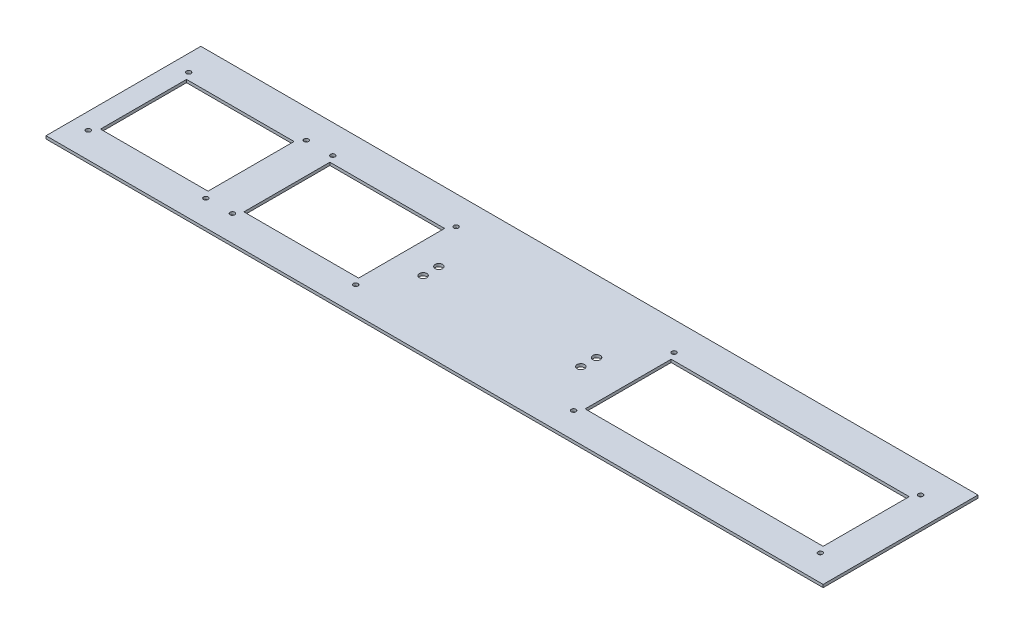
ISO-10303-21;
HEADER;
FILE_DESCRIPTION(('STEP AP214'),'2;1');
FILE_NAME('part.step','',(''),(''),'','','');
FILE_SCHEMA(('AUTOMOTIVE_DESIGN { 1 0 10303 214 1 1 1 1 }'));
ENDSEC;
DATA;
#1=APPLICATION_CONTEXT('core data for automotive mechanical design processes');
#2=APPLICATION_PROTOCOL_DEFINITION('international standard','automotive_design',2000,#1);
#3=PRODUCT_CONTEXT('',#1,'mechanical');
#4=PRODUCT('Part','Part','',(#3));
#5=PRODUCT_RELATED_PRODUCT_CATEGORY('part','',(#4));
#6=PRODUCT_DEFINITION_FORMATION('','',#4);
#7=PRODUCT_DEFINITION_CONTEXT('part definition',#1,'design');
#8=PRODUCT_DEFINITION('design','',#6,#7);
#9=PRODUCT_DEFINITION_SHAPE('','',#8);
#10=(LENGTH_UNIT() NAMED_UNIT(*) SI_UNIT(.MILLI.,.METRE.));
#11=(NAMED_UNIT(*) PLANE_ANGLE_UNIT() SI_UNIT($,.RADIAN.));
#12=(NAMED_UNIT(*) SI_UNIT($,.STERADIAN.) SOLID_ANGLE_UNIT());
#13=UNCERTAINTY_MEASURE_WITH_UNIT(LENGTH_MEASURE(1.E-05),#10,'distance_accuracy_value','');
#14=(GEOMETRIC_REPRESENTATION_CONTEXT(3) GLOBAL_UNCERTAINTY_ASSIGNED_CONTEXT((#13)) GLOBAL_UNIT_ASSIGNED_CONTEXT((#10,
#11,#12)) REPRESENTATION_CONTEXT('',''));
#15=CARTESIAN_POINT('',(0.,0.,0.));
#16=DIRECTION('',(0.,0.,1.));
#17=DIRECTION('',(1.,0.,0.));
#18=AXIS2_PLACEMENT_3D('',#15,#16,#17);
#19=CARTESIAN_POINT('',(0.,0.,108.));
#20=DIRECTION('',(0.,0.,1.));
#21=DIRECTION('',(1.,0.,0.));
#22=AXIS2_PLACEMENT_3D('',#19,#20,#21);
#23=PLANE('',#22);
#24=DIRECTION('',(-1.,0.,0.));
#25=VECTOR('',#24,1.);
#26=CARTESIAN_POINT('',(0.,-1.,108.));
#27=LINE('',#26,#25);
#28=CARTESIAN_POINT('',(271.,-1.,108.));
#29=VERTEX_POINT('',#28);
#30=CARTESIAN_POINT('',(-271.,-1.,108.));
#31=VERTEX_POINT('',#30);
#32=EDGE_CURVE('E332',#29,#31,#27,.T.);
#33=ORIENTED_EDGE('',*,*,#32,.F.);
#34=DIRECTION('',(0.,-1.,0.));
#35=VECTOR('',#34,1.);
#36=CARTESIAN_POINT('',(271.,0.,108.));
#37=LINE('',#36,#35);
#38=CARTESIAN_POINT('',(271.,1.,108.));
#39=VERTEX_POINT('',#38);
#40=EDGE_CURVE('E325',#39,#29,#37,.T.);
#41=ORIENTED_EDGE('',*,*,#40,.F.);
#42=DIRECTION('',(1.,0.,0.));
#43=VECTOR('',#42,1.);
#44=CARTESIAN_POINT('',(0.,1.,108.));
#45=LINE('',#44,#43);
#46=CARTESIAN_POINT('',(-271.,1.,108.));
#47=VERTEX_POINT('',#46);
#48=EDGE_CURVE('E328',#47,#39,#45,.T.);
#49=ORIENTED_EDGE('',*,*,#48,.F.);
#50=DIRECTION('',(0.,1.,0.));
#51=VECTOR('',#50,1.);
#52=CARTESIAN_POINT('',(-271.,0.,108.));
#53=LINE('',#52,#51);
#54=EDGE_CURVE('E330',#31,#47,#53,.T.);
#55=ORIENTED_EDGE('',*,*,#54,.F.);
#56=EDGE_LOOP('',(#33,#41,#49,#55));
#57=FACE_BOUND('',#56,.T.);
#58=ADVANCED_FACE('F16',(#57),#23,.T.);
#59=CARTESIAN_POINT('',(0.,-1.,0.));
#60=DIRECTION('',(0.,-1.,0.));
#61=DIRECTION('',(0.,0.,-1.));
#62=AXIS2_PLACEMENT_3D('',#59,#60,#61);
#63=PLANE('',#62);
#64=CARTESIAN_POINT('',(55.,-1.,61.));
#65=DIRECTION('',(0.,-1.,0.));
#66=DIRECTION('',(0.,0.,-1.));
#67=AXIS2_PLACEMENT_3D('',#64,#65,#66);
#68=CIRCLE('',#67,2.6);
#69=CARTESIAN_POINT('',(55.,-1.,58.4));
#70=VERTEX_POINT('',#69);
#71=EDGE_CURVE('E208',#70,#70,#68,.T.);
#72=ORIENTED_EDGE('',*,*,#71,.F.);
#73=EDGE_LOOP('',(#72));
#74=FACE_BOUND('',#73,.T.);
#75=CARTESIAN_POINT('',(55.,-1.,50.));
#76=DIRECTION('',(0.,-1.,0.));
#77=DIRECTION('',(0.,0.,-1.));
#78=AXIS2_PLACEMENT_3D('',#75,#76,#77);
#79=CIRCLE('',#78,2.6);
#80=CARTESIAN_POINT('',(55.,-1.,47.4));
#81=VERTEX_POINT('',#80);
#82=EDGE_CURVE('E205',#81,#81,#79,.T.);
#83=ORIENTED_EDGE('',*,*,#82,.F.);
#84=EDGE_LOOP('',(#83));
#85=FACE_BOUND('',#84,.T.);
#86=CARTESIAN_POINT('',(-55.,-1.,61.));
#87=DIRECTION('',(0.,-1.,0.));
#88=DIRECTION('',(0.,0.,-1.));
#89=AXIS2_PLACEMENT_3D('',#86,#87,#88);
#90=CIRCLE('',#89,2.6);
#91=CARTESIAN_POINT('',(-55.,-1.,58.4));
#92=VERTEX_POINT('',#91);
#93=EDGE_CURVE('E202',#92,#92,#90,.T.);
#94=ORIENTED_EDGE('',*,*,#93,.F.);
#95=EDGE_LOOP('',(#94));
#96=FACE_BOUND('',#95,.T.);
#97=CARTESIAN_POINT('',(-55.,-1.,50.));
#98=DIRECTION('',(0.,-1.,0.));
#99=DIRECTION('',(0.,0.,-1.));
#100=AXIS2_PLACEMENT_3D('',#97,#98,#99);
#101=CIRCLE('',#100,2.6);
#102=CARTESIAN_POINT('',(-55.,-1.,47.4));
#103=VERTEX_POINT('',#102);
#104=EDGE_CURVE('E198',#103,#103,#101,.T.);
#105=ORIENTED_EDGE('',*,*,#104,.F.);
#106=EDGE_LOOP('',(#105));
#107=FACE_BOUND('',#106,.T.);
#108=CARTESIAN_POINT('',(251.,-1.,90.));
#109=DIRECTION('',(0.,-1.,0.));
#110=DIRECTION('',(0.,0.,-1.));
#111=AXIS2_PLACEMENT_3D('',#108,#109,#110);
#112=CIRCLE('',#111,1.6);
#113=CARTESIAN_POINT('',(251.,-1.,88.4));
#114=VERTEX_POINT('',#113);
#115=EDGE_CURVE('E194',#114,#114,#112,.T.);
#116=ORIENTED_EDGE('',*,*,#115,.F.);
#117=EDGE_LOOP('',(#116));
#118=FACE_BOUND('',#117,.T.);
#119=CARTESIAN_POINT('',(251.,-1.,20.));
#120=DIRECTION('',(0.,-1.,0.));
#121=DIRECTION('',(0.,0.,-1.));
#122=AXIS2_PLACEMENT_3D('',#119,#120,#121);
#123=CIRCLE('',#122,1.6);
#124=CARTESIAN_POINT('',(251.,-1.,18.4));
#125=VERTEX_POINT('',#124);
#126=EDGE_CURVE('E190',#125,#125,#123,.T.);
#127=ORIENTED_EDGE('',*,*,#126,.F.);
#128=EDGE_LOOP('',(#127));
#129=FACE_BOUND('',#128,.T.);
#130=CARTESIAN_POINT('',(79.,-1.,90.));
#131=DIRECTION('',(0.,-1.,0.));
#132=DIRECTION('',(0.,0.,-1.));
#133=AXIS2_PLACEMENT_3D('',#130,#131,#132);
#134=CIRCLE('',#133,1.6);
#135=CARTESIAN_POINT('',(79.,-1.,88.4));
#136=VERTEX_POINT('',#135);
#137=EDGE_CURVE('E186',#136,#136,#134,.T.);
#138=ORIENTED_EDGE('',*,*,#137,.F.);
#139=EDGE_LOOP('',(#138));
#140=FACE_BOUND('',#139,.T.);
#141=CARTESIAN_POINT('',(79.,-1.,20.));
#142=DIRECTION('',(0.,-1.,0.));
#143=DIRECTION('',(0.,0.,-1.));
#144=AXIS2_PLACEMENT_3D('',#141,#142,#143);
#145=CIRCLE('',#144,1.6);
#146=CARTESIAN_POINT('',(79.,-1.,18.4));
#147=VERTEX_POINT('',#146);
#148=EDGE_CURVE('E182',#147,#147,#145,.T.);
#149=ORIENTED_EDGE('',*,*,#148,.F.);
#150=EDGE_LOOP('',(#149));
#151=FACE_BOUND('',#150,.T.);
#152=CARTESIAN_POINT('',(-73.,-1.,90.));
#153=DIRECTION('',(0.,-1.,0.));
#154=DIRECTION('',(0.,0.,-1.));
#155=AXIS2_PLACEMENT_3D('',#152,#153,#154);
#156=CIRCLE('',#155,1.6);
#157=CARTESIAN_POINT('',(-73.,-1.,88.4));
#158=VERTEX_POINT('',#157);
#159=EDGE_CURVE('E178',#158,#158,#156,.T.);
#160=ORIENTED_EDGE('',*,*,#159,.F.);
#161=EDGE_LOOP('',(#160));
#162=FACE_BOUND('',#161,.T.);
#163=CARTESIAN_POINT('',(-73.,-1.,20.));
#164=DIRECTION('',(0.,-1.,0.));
#165=DIRECTION('',(0.,0.,-1.));
#166=AXIS2_PLACEMENT_3D('',#163,#164,#165);
#167=CIRCLE('',#166,1.6);
#168=CARTESIAN_POINT('',(-73.,-1.,18.4));
#169=VERTEX_POINT('',#168);
#170=EDGE_CURVE('E174',#169,#169,#167,.T.);
#171=ORIENTED_EDGE('',*,*,#170,.F.);
#172=EDGE_LOOP('',(#171));
#173=FACE_BOUND('',#172,.T.);
#174=CARTESIAN_POINT('',(-159.,-1.,90.));
#175=DIRECTION('',(0.,-1.,0.));
#176=DIRECTION('',(0.,0.,-1.));
#177=AXIS2_PLACEMENT_3D('',#174,#175,#176);
#178=CIRCLE('',#177,1.6);
#179=CARTESIAN_POINT('',(-159.,-1.,88.4));
#180=VERTEX_POINT('',#179);
#181=EDGE_CURVE('E170',#180,#180,#178,.T.);
#182=ORIENTED_EDGE('',*,*,#181,.F.);
#183=EDGE_LOOP('',(#182));
#184=FACE_BOUND('',#183,.T.);
#185=CARTESIAN_POINT('',(-159.,-1.,20.));
#186=DIRECTION('',(0.,-1.,0.));
#187=DIRECTION('',(0.,0.,-1.));
#188=AXIS2_PLACEMENT_3D('',#185,#186,#187);
#189=CIRCLE('',#188,1.6);
#190=CARTESIAN_POINT('',(-159.,-1.,18.4));
#191=VERTEX_POINT('',#190);
#192=EDGE_CURVE('E166',#191,#191,#189,.T.);
#193=ORIENTED_EDGE('',*,*,#192,.F.);
#194=EDGE_LOOP('',(#193));
#195=FACE_BOUND('',#194,.T.);
#196=CARTESIAN_POINT('',(-177.5,-1.,90.));
#197=DIRECTION('',(0.,-1.,0.));
#198=DIRECTION('',(0.,0.,-1.));
#199=AXIS2_PLACEMENT_3D('',#196,#197,#198);
#200=CIRCLE('',#199,1.6);
#201=CARTESIAN_POINT('',(-177.5,-1.,88.4));
#202=VERTEX_POINT('',#201);
#203=EDGE_CURVE('E162',#202,#202,#200,.T.);
#204=ORIENTED_EDGE('',*,*,#203,.F.);
#205=EDGE_LOOP('',(#204));
#206=FACE_BOUND('',#205,.T.);
#207=CARTESIAN_POINT('',(-177.5,-1.,20.));
#208=DIRECTION('',(0.,-1.,0.));
#209=DIRECTION('',(0.,0.,-1.));
#210=AXIS2_PLACEMENT_3D('',#207,#208,#209);
#211=CIRCLE('',#210,1.6);
#212=CARTESIAN_POINT('',(-177.5,-1.,18.4));
#213=VERTEX_POINT('',#212);
#214=EDGE_CURVE('E158',#213,#213,#211,.T.);
#215=ORIENTED_EDGE('',*,*,#214,.F.);
#216=EDGE_LOOP('',(#215));
#217=FACE_BOUND('',#216,.T.);
#218=CARTESIAN_POINT('',(-259.5,-1.,90.));
#219=DIRECTION('',(0.,-1.,0.));
#220=DIRECTION('',(0.,0.,-1.));
#221=AXIS2_PLACEMENT_3D('',#218,#219,#220);
#222=CIRCLE('',#221,1.6);
#223=CARTESIAN_POINT('',(-259.5,-1.,88.4));
#224=VERTEX_POINT('',#223);
#225=EDGE_CURVE('E154',#224,#224,#222,.T.);
#226=ORIENTED_EDGE('',*,*,#225,.F.);
#227=EDGE_LOOP('',(#226));
#228=FACE_BOUND('',#227,.T.);
#229=CARTESIAN_POINT('',(-259.5,-1.,20.));
#230=DIRECTION('',(0.,-1.,0.));
#231=DIRECTION('',(0.,0.,-1.));
#232=AXIS2_PLACEMENT_3D('',#229,#230,#231);
#233=CIRCLE('',#232,1.6);
#234=CARTESIAN_POINT('',(-259.5,-1.,18.4));
#235=VERTEX_POINT('',#234);
#236=EDGE_CURVE('E153',#235,#235,#233,.T.);
#237=ORIENTED_EDGE('',*,*,#236,.F.);
#238=EDGE_LOOP('',(#237));
#239=FACE_BOUND('',#238,.T.);
#240=DIRECTION('',(-1.,0.,0.));
#241=VECTOR('',#240,1.);
#242=CARTESIAN_POINT('',(0.,-1.,85.));
#243=LINE('',#242,#241);
#244=CARTESIAN_POINT('',(248.,-1.,85.));
#245=VERTEX_POINT('',#244);
#246=CARTESIAN_POINT('',(82.,-1.,85.));
#247=VERTEX_POINT('',#246);
#248=EDGE_CURVE('E257',#245,#247,#243,.T.);
#249=ORIENTED_EDGE('',*,*,#248,.F.);
#250=DIRECTION('',(0.,0.,1.));
#251=VECTOR('',#250,1.);
#252=CARTESIAN_POINT('',(248.,-1.,0.));
#253=LINE('',#252,#251);
#254=CARTESIAN_POINT('',(248.,-1.,25.));
#255=VERTEX_POINT('',#254);
#256=EDGE_CURVE('E252',#255,#245,#253,.T.);
#257=ORIENTED_EDGE('',*,*,#256,.F.);
#258=DIRECTION('',(1.,0.,0.));
#259=VECTOR('',#258,1.);
#260=CARTESIAN_POINT('',(0.,-1.,25.));
#261=LINE('',#260,#259);
#262=CARTESIAN_POINT('',(82.,-1.,25.));
#263=VERTEX_POINT('',#262);
#264=EDGE_CURVE('E139',#263,#255,#261,.T.);
#265=ORIENTED_EDGE('',*,*,#264,.F.);
#266=DIRECTION('',(0.,0.,-1.));
#267=VECTOR('',#266,1.);
#268=CARTESIAN_POINT('',(82.,-1.,0.));
#269=LINE('',#268,#267);
#270=EDGE_CURVE('E255',#247,#263,#269,.T.);
#271=ORIENTED_EDGE('',*,*,#270,.F.);
#272=EDGE_LOOP('',(#249,#257,#265,#271));
#273=FACE_BOUND('',#272,.T.);
#274=DIRECTION('',(-1.,0.,0.));
#275=VECTOR('',#274,1.);
#276=CARTESIAN_POINT('',(0.,-1.,85.));
#277=LINE('',#276,#275);
#278=CARTESIAN_POINT('',(-76.,-1.,85.));
#279=VERTEX_POINT('',#278);
#280=CARTESIAN_POINT('',(-156.,-1.,85.));
#281=VERTEX_POINT('',#280);
#282=EDGE_CURVE('E278',#279,#281,#277,.T.);
#283=ORIENTED_EDGE('',*,*,#282,.F.);
#284=DIRECTION('',(0.,0.,1.));
#285=VECTOR('',#284,1.);
#286=CARTESIAN_POINT('',(-76.,-1.,0.));
#287=LINE('',#286,#285);
#288=CARTESIAN_POINT('',(-76.,-1.,25.));
#289=VERTEX_POINT('',#288);
#290=EDGE_CURVE('E271',#289,#279,#287,.T.);
#291=ORIENTED_EDGE('',*,*,#290,.F.);
#292=DIRECTION('',(1.,0.,0.));
#293=VECTOR('',#292,1.);
#294=CARTESIAN_POINT('',(0.,-1.,25.));
#295=LINE('',#294,#293);
#296=CARTESIAN_POINT('',(-156.,-1.,25.));
#297=VERTEX_POINT('',#296);
#298=EDGE_CURVE('E273',#297,#289,#295,.T.);
#299=ORIENTED_EDGE('',*,*,#298,.F.);
#300=DIRECTION('',(0.,0.,-1.));
#301=VECTOR('',#300,1.);
#302=CARTESIAN_POINT('',(-156.,-1.,0.));
#303=LINE('',#302,#301);
#304=EDGE_CURVE('E276',#281,#297,#303,.T.);
#305=ORIENTED_EDGE('',*,*,#304,.F.);
#306=EDGE_LOOP('',(#283,#291,#299,#305));
#307=FACE_BOUND('',#306,.T.);
#308=DIRECTION('',(-1.,0.,0.));
#309=VECTOR('',#308,1.);
#310=CARTESIAN_POINT('',(0.,-1.,85.));
#311=LINE('',#310,#309);
#312=CARTESIAN_POINT('',(-181.,-1.,85.));
#313=VERTEX_POINT('',#312);
#314=CARTESIAN_POINT('',(-256.,-1.,85.));
#315=VERTEX_POINT('',#314);
#316=EDGE_CURVE('E299',#313,#315,#311,.T.);
#317=ORIENTED_EDGE('',*,*,#316,.F.);
#318=DIRECTION('',(0.,0.,1.));
#319=VECTOR('',#318,1.);
#320=CARTESIAN_POINT('',(-181.,-1.,0.));
#321=LINE('',#320,#319);
#322=CARTESIAN_POINT('',(-181.,-1.,25.));
#323=VERTEX_POINT('',#322);
#324=EDGE_CURVE('E292',#323,#313,#321,.T.);
#325=ORIENTED_EDGE('',*,*,#324,.F.);
#326=DIRECTION('',(1.,0.,0.));
#327=VECTOR('',#326,1.);
#328=CARTESIAN_POINT('',(0.,-1.,25.));
#329=LINE('',#328,#327);
#330=CARTESIAN_POINT('',(-256.,-1.,25.));
#331=VERTEX_POINT('',#330);
#332=EDGE_CURVE('E294',#331,#323,#329,.T.);
#333=ORIENTED_EDGE('',*,*,#332,.F.);
#334=DIRECTION('',(0.,0.,-1.));
#335=VECTOR('',#334,1.);
#336=CARTESIAN_POINT('',(-256.,-1.,0.));
#337=LINE('',#336,#335);
#338=EDGE_CURVE('E297',#315,#331,#337,.T.);
#339=ORIENTED_EDGE('',*,*,#338,.F.);
#340=EDGE_LOOP('',(#317,#325,#333,#339));
#341=FACE_BOUND('',#340,.T.);
#342=DIRECTION('',(0.,0.,1.));
#343=VECTOR('',#342,1.);
#344=CARTESIAN_POINT('',(271.,-1.,0.));
#345=LINE('',#344,#343);
#346=CARTESIAN_POINT('',(271.,-1.,0.));
#347=VERTEX_POINT('',#346);
#348=EDGE_CURVE('E308',#347,#29,#345,.T.);
#349=ORIENTED_EDGE('',*,*,#348,.T.);
#350=ORIENTED_EDGE('',*,*,#32,.T.);
#351=DIRECTION('',(0.,0.,1.));
#352=VECTOR('',#351,1.);
#353=CARTESIAN_POINT('',(-271.,-1.,0.));
#354=LINE('',#353,#352);
#355=CARTESIAN_POINT('',(-271.,-1.,0.));
#356=VERTEX_POINT('',#355);
#357=EDGE_CURVE('E322',#356,#31,#354,.T.);
#358=ORIENTED_EDGE('',*,*,#357,.F.);
#359=DIRECTION('',(1.,0.,0.));
#360=VECTOR('',#359,1.);
#361=CARTESIAN_POINT('',(0.,-1.,0.));
#362=LINE('',#361,#360);
#363=EDGE_CURVE('E301',#356,#347,#362,.T.);
#364=ORIENTED_EDGE('',*,*,#363,.T.);
#365=EDGE_LOOP('',(#349,#350,#358,#364));
#366=FACE_BOUND('',#365,.T.);
#367=ADVANCED_FACE('F367',(#74,#85,#96,#107,#118,#129,#140,#151,#162,#173,#184,#195,#206,#217,
#228,#239,#273,#307,#341,#366),#63,.T.);
#368=CARTESIAN_POINT('',(-271.,0.,0.));
#369=DIRECTION('',(-1.,0.,0.));
#370=DIRECTION('',(0.,0.,1.));
#371=AXIS2_PLACEMENT_3D('',#368,#369,#370);
#372=PLANE('',#371);
#373=ORIENTED_EDGE('',*,*,#357,.T.);
#374=ORIENTED_EDGE('',*,*,#54,.T.);
#375=DIRECTION('',(0.,0.,1.));
#376=VECTOR('',#375,1.);
#377=CARTESIAN_POINT('',(-271.,1.,0.));
#378=LINE('',#377,#376);
#379=CARTESIAN_POINT('',(-271.,1.,0.));
#380=VERTEX_POINT('',#379);
#381=EDGE_CURVE('E319',#380,#47,#378,.T.);
#382=ORIENTED_EDGE('',*,*,#381,.F.);
#383=DIRECTION('',(0.,-1.,0.));
#384=VECTOR('',#383,1.);
#385=CARTESIAN_POINT('',(-271.,0.,0.));
#386=LINE('',#385,#384);
#387=EDGE_CURVE('E304',#380,#356,#386,.T.);
#388=ORIENTED_EDGE('',*,*,#387,.T.);
#389=EDGE_LOOP('',(#373,#374,#382,#388));
#390=FACE_BOUND('',#389,.T.);
#391=ADVANCED_FACE('F387',(#390),#372,.T.);
#392=CARTESIAN_POINT('',(0.,1.,0.));
#393=DIRECTION('',(0.,1.,0.));
#394=DIRECTION('',(0.,0.,1.));
#395=AXIS2_PLACEMENT_3D('',#392,#393,#394);
#396=PLANE('',#395);
#397=CARTESIAN_POINT('',(55.,1.,61.));
#398=DIRECTION('',(0.,1.,0.));
#399=DIRECTION('',(0.,0.,1.));
#400=AXIS2_PLACEMENT_3D('',#397,#398,#399);
#401=CIRCLE('',#400,2.6);
#402=CARTESIAN_POINT('',(55.,1.,63.6));
#403=VERTEX_POINT('',#402);
#404=EDGE_CURVE('E19',#403,#403,#401,.T.);
#405=ORIENTED_EDGE('',*,*,#404,.F.);
#406=EDGE_LOOP('',(#405));
#407=FACE_BOUND('',#406,.T.);
#408=CARTESIAN_POINT('',(55.,1.,50.));
#409=DIRECTION('',(0.,1.,0.));
#410=DIRECTION('',(0.,0.,1.));
#411=AXIS2_PLACEMENT_3D('',#408,#409,#410);
#412=CIRCLE('',#411,2.6);
#413=CARTESIAN_POINT('',(55.,1.,52.6));
#414=VERTEX_POINT('',#413);
#415=EDGE_CURVE('E206',#414,#414,#412,.T.);
#416=ORIENTED_EDGE('',*,*,#415,.F.);
#417=EDGE_LOOP('',(#416));
#418=FACE_BOUND('',#417,.T.);
#419=CARTESIAN_POINT('',(-55.,1.,61.));
#420=DIRECTION('',(0.,1.,0.));
#421=DIRECTION('',(0.,0.,1.));
#422=AXIS2_PLACEMENT_3D('',#419,#420,#421);
#423=CIRCLE('',#422,2.6);
#424=CARTESIAN_POINT('',(-55.,1.,63.6));
#425=VERTEX_POINT('',#424);
#426=EDGE_CURVE('E203',#425,#425,#423,.T.);
#427=ORIENTED_EDGE('',*,*,#426,.F.);
#428=EDGE_LOOP('',(#427));
#429=FACE_BOUND('',#428,.T.);
#430=CARTESIAN_POINT('',(-55.,1.,50.));
#431=DIRECTION('',(0.,1.,0.));
#432=DIRECTION('',(0.,0.,1.));
#433=AXIS2_PLACEMENT_3D('',#430,#431,#432);
#434=CIRCLE('',#433,2.6);
#435=CARTESIAN_POINT('',(-55.,1.,52.6));
#436=VERTEX_POINT('',#435);
#437=EDGE_CURVE('E199',#436,#436,#434,.T.);
#438=ORIENTED_EDGE('',*,*,#437,.F.);
#439=EDGE_LOOP('',(#438));
#440=FACE_BOUND('',#439,.T.);
#441=CARTESIAN_POINT('',(251.,1.,90.));
#442=DIRECTION('',(0.,1.,0.));
#443=DIRECTION('',(0.,0.,1.));
#444=AXIS2_PLACEMENT_3D('',#441,#442,#443);
#445=CIRCLE('',#444,1.6);
#446=CARTESIAN_POINT('',(251.,1.,91.6));
#447=VERTEX_POINT('',#446);
#448=EDGE_CURVE('E195',#447,#447,#445,.T.);
#449=ORIENTED_EDGE('',*,*,#448,.F.);
#450=EDGE_LOOP('',(#449));
#451=FACE_BOUND('',#450,.T.);
#452=CARTESIAN_POINT('',(251.,1.,20.));
#453=DIRECTION('',(0.,1.,0.));
#454=DIRECTION('',(0.,0.,1.));
#455=AXIS2_PLACEMENT_3D('',#452,#453,#454);
#456=CIRCLE('',#455,1.6);
#457=CARTESIAN_POINT('',(251.,1.,21.6));
#458=VERTEX_POINT('',#457);
#459=EDGE_CURVE('E191',#458,#458,#456,.T.);
#460=ORIENTED_EDGE('',*,*,#459,.F.);
#461=EDGE_LOOP('',(#460));
#462=FACE_BOUND('',#461,.T.);
#463=CARTESIAN_POINT('',(79.,1.,90.));
#464=DIRECTION('',(0.,1.,0.));
#465=DIRECTION('',(0.,0.,1.));
#466=AXIS2_PLACEMENT_3D('',#463,#464,#465);
#467=CIRCLE('',#466,1.6);
#468=CARTESIAN_POINT('',(79.,1.,91.6));
#469=VERTEX_POINT('',#468);
#470=EDGE_CURVE('E187',#469,#469,#467,.T.);
#471=ORIENTED_EDGE('',*,*,#470,.F.);
#472=EDGE_LOOP('',(#471));
#473=FACE_BOUND('',#472,.T.);
#474=CARTESIAN_POINT('',(79.,1.,20.));
#475=DIRECTION('',(0.,1.,0.));
#476=DIRECTION('',(0.,0.,1.));
#477=AXIS2_PLACEMENT_3D('',#474,#475,#476);
#478=CIRCLE('',#477,1.6);
#479=CARTESIAN_POINT('',(79.,1.,21.6));
#480=VERTEX_POINT('',#479);
#481=EDGE_CURVE('E183',#480,#480,#478,.T.);
#482=ORIENTED_EDGE('',*,*,#481,.F.);
#483=EDGE_LOOP('',(#482));
#484=FACE_BOUND('',#483,.T.);
#485=CARTESIAN_POINT('',(-73.,1.,90.));
#486=DIRECTION('',(0.,1.,0.));
#487=DIRECTION('',(0.,0.,1.));
#488=AXIS2_PLACEMENT_3D('',#485,#486,#487);
#489=CIRCLE('',#488,1.6);
#490=CARTESIAN_POINT('',(-73.,1.,91.6));
#491=VERTEX_POINT('',#490);
#492=EDGE_CURVE('E179',#491,#491,#489,.T.);
#493=ORIENTED_EDGE('',*,*,#492,.F.);
#494=EDGE_LOOP('',(#493));
#495=FACE_BOUND('',#494,.T.);
#496=CARTESIAN_POINT('',(-73.,1.,20.));
#497=DIRECTION('',(0.,1.,0.));
#498=DIRECTION('',(0.,0.,1.));
#499=AXIS2_PLACEMENT_3D('',#496,#497,#498);
#500=CIRCLE('',#499,1.6);
#501=CARTESIAN_POINT('',(-73.,1.,21.6));
#502=VERTEX_POINT('',#501);
#503=EDGE_CURVE('E175',#502,#502,#500,.T.);
#504=ORIENTED_EDGE('',*,*,#503,.F.);
#505=EDGE_LOOP('',(#504));
#506=FACE_BOUND('',#505,.T.);
#507=CARTESIAN_POINT('',(-159.,1.,90.));
#508=DIRECTION('',(0.,1.,0.));
#509=DIRECTION('',(0.,0.,1.));
#510=AXIS2_PLACEMENT_3D('',#507,#508,#509);
#511=CIRCLE('',#510,1.6);
#512=CARTESIAN_POINT('',(-159.,1.,91.6));
#513=VERTEX_POINT('',#512);
#514=EDGE_CURVE('E171',#513,#513,#511,.T.);
#515=ORIENTED_EDGE('',*,*,#514,.F.);
#516=EDGE_LOOP('',(#515));
#517=FACE_BOUND('',#516,.T.);
#518=CARTESIAN_POINT('',(-159.,1.,20.));
#519=DIRECTION('',(0.,1.,0.));
#520=DIRECTION('',(0.,0.,1.));
#521=AXIS2_PLACEMENT_3D('',#518,#519,#520);
#522=CIRCLE('',#521,1.6);
#523=CARTESIAN_POINT('',(-159.,1.,21.6));
#524=VERTEX_POINT('',#523);
#525=EDGE_CURVE('E167',#524,#524,#522,.T.);
#526=ORIENTED_EDGE('',*,*,#525,.F.);
#527=EDGE_LOOP('',(#526));
#528=FACE_BOUND('',#527,.T.);
#529=CARTESIAN_POINT('',(-177.5,1.,90.));
#530=DIRECTION('',(0.,1.,0.));
#531=DIRECTION('',(0.,0.,1.));
#532=AXIS2_PLACEMENT_3D('',#529,#530,#531);
#533=CIRCLE('',#532,1.6);
#534=CARTESIAN_POINT('',(-177.5,1.,91.6));
#535=VERTEX_POINT('',#534);
#536=EDGE_CURVE('E163',#535,#535,#533,.T.);
#537=ORIENTED_EDGE('',*,*,#536,.F.);
#538=EDGE_LOOP('',(#537));
#539=FACE_BOUND('',#538,.T.);
#540=CARTESIAN_POINT('',(-177.5,1.,20.));
#541=DIRECTION('',(0.,1.,0.));
#542=DIRECTION('',(0.,0.,1.));
#543=AXIS2_PLACEMENT_3D('',#540,#541,#542);
#544=CIRCLE('',#543,1.6);
#545=CARTESIAN_POINT('',(-177.5,1.,21.6));
#546=VERTEX_POINT('',#545);
#547=EDGE_CURVE('E159',#546,#546,#544,.T.);
#548=ORIENTED_EDGE('',*,*,#547,.F.);
#549=EDGE_LOOP('',(#548));
#550=FACE_BOUND('',#549,.T.);
#551=CARTESIAN_POINT('',(-259.5,1.,90.));
#552=DIRECTION('',(0.,1.,0.));
#553=DIRECTION('',(0.,0.,1.));
#554=AXIS2_PLACEMENT_3D('',#551,#552,#553);
#555=CIRCLE('',#554,1.6);
#556=CARTESIAN_POINT('',(-259.5,1.,91.6));
#557=VERTEX_POINT('',#556);
#558=EDGE_CURVE('E155',#557,#557,#555,.T.);
#559=ORIENTED_EDGE('',*,*,#558,.F.);
#560=EDGE_LOOP('',(#559));
#561=FACE_BOUND('',#560,.T.);
#562=CARTESIAN_POINT('',(-259.5,1.,20.));
#563=DIRECTION('',(0.,1.,0.));
#564=DIRECTION('',(0.,0.,1.));
#565=AXIS2_PLACEMENT_3D('',#562,#563,#564);
#566=CIRCLE('',#565,1.6);
#567=CARTESIAN_POINT('',(-259.5,1.,21.6));
#568=VERTEX_POINT('',#567);
#569=EDGE_CURVE('E150',#568,#568,#566,.T.);
#570=ORIENTED_EDGE('',*,*,#569,.F.);
#571=EDGE_LOOP('',(#570));
#572=FACE_BOUND('',#571,.T.);
#573=DIRECTION('',(1.,0.,0.));
#574=VECTOR('',#573,1.);
#575=CARTESIAN_POINT('',(0.,1.,85.));
#576=LINE('',#575,#574);
#577=CARTESIAN_POINT('',(82.,1.,85.));
#578=VERTEX_POINT('',#577);
#579=CARTESIAN_POINT('',(248.,1.,85.));
#580=VERTEX_POINT('',#579);
#581=EDGE_CURVE('E10',#578,#580,#576,.T.);
#582=ORIENTED_EDGE('',*,*,#581,.F.);
#583=DIRECTION('',(0.,0.,1.));
#584=VECTOR('',#583,1.);
#585=CARTESIAN_POINT('',(82.,1.,0.));
#586=LINE('',#585,#584);
#587=CARTESIAN_POINT('',(82.,1.,25.));
#588=VERTEX_POINT('',#587);
#589=EDGE_CURVE('E24',#588,#578,#586,.T.);
#590=ORIENTED_EDGE('',*,*,#589,.F.);
#591=DIRECTION('',(-1.,0.,0.));
#592=VECTOR('',#591,1.);
#593=CARTESIAN_POINT('',(0.,1.,25.));
#594=LINE('',#593,#592);
#595=CARTESIAN_POINT('',(248.,1.,25.));
#596=VERTEX_POINT('',#595);
#597=EDGE_CURVE('E131',#596,#588,#594,.T.);
#598=ORIENTED_EDGE('',*,*,#597,.F.);
#599=DIRECTION('',(0.,0.,-1.));
#600=VECTOR('',#599,1.);
#601=CARTESIAN_POINT('',(248.,1.,0.));
#602=LINE('',#601,#600);
#603=EDGE_CURVE('E126',#580,#596,#602,.T.);
#604=ORIENTED_EDGE('',*,*,#603,.F.);
#605=EDGE_LOOP('',(#582,#590,#598,#604));
#606=FACE_BOUND('',#605,.T.);
#607=DIRECTION('',(1.,0.,0.));
#608=VECTOR('',#607,1.);
#609=CARTESIAN_POINT('',(0.,1.,85.));
#610=LINE('',#609,#608);
#611=CARTESIAN_POINT('',(-156.,1.,85.));
#612=VERTEX_POINT('',#611);
#613=CARTESIAN_POINT('',(-76.,1.,85.));
#614=VERTEX_POINT('',#613);
#615=EDGE_CURVE('E132',#612,#614,#610,.T.);
#616=ORIENTED_EDGE('',*,*,#615,.F.);
#617=DIRECTION('',(0.,0.,1.));
#618=VECTOR('',#617,1.);
#619=CARTESIAN_POINT('',(-156.,1.,0.));
#620=LINE('',#619,#618);
#621=CARTESIAN_POINT('',(-156.,1.,25.));
#622=VERTEX_POINT('',#621);
#623=EDGE_CURVE('E347',#622,#612,#620,.T.);
#624=ORIENTED_EDGE('',*,*,#623,.F.);
#625=DIRECTION('',(-1.,0.,0.));
#626=VECTOR('',#625,1.);
#627=CARTESIAN_POINT('',(0.,1.,25.));
#628=LINE('',#627,#626);
#629=CARTESIAN_POINT('',(-76.,1.,25.));
#630=VERTEX_POINT('',#629);
#631=EDGE_CURVE('E345',#630,#622,#628,.T.);
#632=ORIENTED_EDGE('',*,*,#631,.F.);
#633=DIRECTION('',(0.,0.,-1.));
#634=VECTOR('',#633,1.);
#635=CARTESIAN_POINT('',(-76.,1.,0.));
#636=LINE('',#635,#634);
#637=EDGE_CURVE('E343',#614,#630,#636,.T.);
#638=ORIENTED_EDGE('',*,*,#637,.F.);
#639=EDGE_LOOP('',(#616,#624,#632,#638));
#640=FACE_BOUND('',#639,.T.);
#641=DIRECTION('',(1.,0.,0.));
#642=VECTOR('',#641,1.);
#643=CARTESIAN_POINT('',(0.,1.,85.));
#644=LINE('',#643,#642);
#645=CARTESIAN_POINT('',(-256.,1.,85.));
#646=VERTEX_POINT('',#645);
#647=CARTESIAN_POINT('',(-181.,1.,85.));
#648=VERTEX_POINT('',#647);
#649=EDGE_CURVE('E340',#646,#648,#644,.T.);
#650=ORIENTED_EDGE('',*,*,#649,.F.);
#651=DIRECTION('',(0.,0.,1.));
#652=VECTOR('',#651,1.);
#653=CARTESIAN_POINT('',(-256.,1.,0.));
#654=LINE('',#653,#652);
#655=CARTESIAN_POINT('',(-256.,1.,25.));
#656=VERTEX_POINT('',#655);
#657=EDGE_CURVE('E338',#656,#646,#654,.T.);
#658=ORIENTED_EDGE('',*,*,#657,.F.);
#659=DIRECTION('',(-1.,0.,0.));
#660=VECTOR('',#659,1.);
#661=CARTESIAN_POINT('',(0.,1.,25.));
#662=LINE('',#661,#660);
#663=CARTESIAN_POINT('',(-181.,1.,25.));
#664=VERTEX_POINT('',#663);
#665=EDGE_CURVE('E336',#664,#656,#662,.T.);
#666=ORIENTED_EDGE('',*,*,#665,.F.);
#667=DIRECTION('',(0.,0.,-1.));
#668=VECTOR('',#667,1.);
#669=CARTESIAN_POINT('',(-181.,1.,0.));
#670=LINE('',#669,#668);
#671=EDGE_CURVE('E334',#648,#664,#670,.T.);
#672=ORIENTED_EDGE('',*,*,#671,.F.);
#673=EDGE_LOOP('',(#650,#658,#666,#672));
#674=FACE_BOUND('',#673,.T.);
#675=ORIENTED_EDGE('',*,*,#381,.T.);
#676=ORIENTED_EDGE('',*,*,#48,.T.);
#677=DIRECTION('',(0.,0.,1.));
#678=VECTOR('',#677,1.);
#679=CARTESIAN_POINT('',(271.,1.,0.));
#680=LINE('',#679,#678);
#681=CARTESIAN_POINT('',(271.,1.,0.));
#682=VERTEX_POINT('',#681);
#683=EDGE_CURVE('E316',#682,#39,#680,.T.);
#684=ORIENTED_EDGE('',*,*,#683,.F.);
#685=DIRECTION('',(-1.,0.,0.));
#686=VECTOR('',#685,1.);
#687=CARTESIAN_POINT('',(0.,1.,0.));
#688=LINE('',#687,#686);
#689=EDGE_CURVE('E309',#682,#380,#688,.T.);
#690=ORIENTED_EDGE('',*,*,#689,.T.);
#691=EDGE_LOOP('',(#675,#676,#684,#690));
#692=FACE_BOUND('',#691,.T.);
#693=ADVANCED_FACE('F144',(#407,#418,#429,#440,#451,#462,#473,#484,#495,#506,#517,#528,#539,
#550,#561,#572,#606,#640,#674,#692),#396,.T.);
#694=CARTESIAN_POINT('',(0.,0.,0.));
#695=DIRECTION('',(0.,0.,-1.));
#696=DIRECTION('',(-1.,0.,0.));
#697=AXIS2_PLACEMENT_3D('',#694,#695,#696);
#698=PLANE('',#697);
#699=DIRECTION('',(0.,1.,0.));
#700=VECTOR('',#699,1.);
#701=CARTESIAN_POINT('',(271.,0.,0.));
#702=LINE('',#701,#700);
#703=EDGE_CURVE('E305',#347,#682,#702,.T.);
#704=ORIENTED_EDGE('',*,*,#703,.F.);
#705=ORIENTED_EDGE('',*,*,#363,.F.);
#706=ORIENTED_EDGE('',*,*,#387,.F.);
#707=ORIENTED_EDGE('',*,*,#689,.F.);
#708=EDGE_LOOP('',(#704,#705,#706,#707));
#709=FACE_BOUND('',#708,.T.);
#710=ADVANCED_FACE('F400',(#709),#698,.T.);
#711=CARTESIAN_POINT('',(271.,0.,0.));
#712=DIRECTION('',(1.,0.,0.));
#713=DIRECTION('',(0.,0.,-1.));
#714=AXIS2_PLACEMENT_3D('',#711,#712,#713);
#715=PLANE('',#714);
#716=ORIENTED_EDGE('',*,*,#703,.T.);
#717=ORIENTED_EDGE('',*,*,#683,.T.);
#718=ORIENTED_EDGE('',*,*,#40,.T.);
#719=ORIENTED_EDGE('',*,*,#348,.F.);
#720=EDGE_LOOP('',(#716,#717,#718,#719));
#721=FACE_BOUND('',#720,.T.);
#722=ADVANCED_FACE('F394',(#721),#715,.T.);
#723=CARTESIAN_POINT('',(-218.5,0.,85.));
#724=DIRECTION('',(0.,0.,1.));
#725=DIRECTION('',(1.,0.,0.));
#726=AXIS2_PLACEMENT_3D('',#723,#724,#725);
#727=PLANE('',#726);
#728=ORIENTED_EDGE('',*,*,#316,.T.);
#729=DIRECTION('',(0.,1.,0.));
#730=VECTOR('',#729,1.);
#731=CARTESIAN_POINT('',(-256.,0.,85.));
#732=LINE('',#731,#730);
#733=EDGE_CURVE('E289',#315,#646,#732,.T.);
#734=ORIENTED_EDGE('',*,*,#733,.T.);
#735=ORIENTED_EDGE('',*,*,#649,.T.);
#736=DIRECTION('',(0.,-1.,0.));
#737=VECTOR('',#736,1.);
#738=CARTESIAN_POINT('',(-181.,0.,85.));
#739=LINE('',#738,#737);
#740=EDGE_CURVE('E284',#648,#313,#739,.T.);
#741=ORIENTED_EDGE('',*,*,#740,.T.);
#742=EDGE_LOOP('',(#728,#734,#735,#741));
#743=FACE_BOUND('',#742,.T.);
#744=ADVANCED_FACE('F413',(#743),#727,.F.);
#745=CARTESIAN_POINT('',(-256.,0.,25.));
#746=DIRECTION('',(-1.,0.,0.));
#747=DIRECTION('',(0.,0.,1.));
#748=AXIS2_PLACEMENT_3D('',#745,#746,#747);
#749=PLANE('',#748);
#750=ORIENTED_EDGE('',*,*,#338,.T.);
#751=DIRECTION('',(0.,-1.,0.));
#752=VECTOR('',#751,1.);
#753=CARTESIAN_POINT('',(-256.,0.,25.));
#754=LINE('',#753,#752);
#755=EDGE_CURVE('E280',#656,#331,#754,.T.);
#756=ORIENTED_EDGE('',*,*,#755,.F.);
#757=ORIENTED_EDGE('',*,*,#657,.T.);
#758=ORIENTED_EDGE('',*,*,#733,.F.);
#759=EDGE_LOOP('',(#750,#756,#757,#758));
#760=FACE_BOUND('',#759,.T.);
#761=ADVANCED_FACE('F418',(#760),#749,.F.);
#762=CARTESIAN_POINT('',(-218.5,0.,25.));
#763=DIRECTION('',(0.,0.,-1.));
#764=DIRECTION('',(-1.,0.,0.));
#765=AXIS2_PLACEMENT_3D('',#762,#763,#764);
#766=PLANE('',#765);
#767=ORIENTED_EDGE('',*,*,#332,.T.);
#768=DIRECTION('',(0.,1.,0.));
#769=VECTOR('',#768,1.);
#770=CARTESIAN_POINT('',(-181.,0.,25.));
#771=LINE('',#770,#769);
#772=EDGE_CURVE('E281',#323,#664,#771,.T.);
#773=ORIENTED_EDGE('',*,*,#772,.T.);
#774=ORIENTED_EDGE('',*,*,#665,.T.);
#775=ORIENTED_EDGE('',*,*,#755,.T.);
#776=EDGE_LOOP('',(#767,#773,#774,#775));
#777=FACE_BOUND('',#776,.T.);
#778=ADVANCED_FACE('F422',(#777),#766,.F.);
#779=CARTESIAN_POINT('',(-181.,0.,25.));
#780=DIRECTION('',(1.,0.,0.));
#781=DIRECTION('',(0.,0.,-1.));
#782=AXIS2_PLACEMENT_3D('',#779,#780,#781);
#783=PLANE('',#782);
#784=ORIENTED_EDGE('',*,*,#324,.T.);
#785=ORIENTED_EDGE('',*,*,#740,.F.);
#786=ORIENTED_EDGE('',*,*,#671,.T.);
#787=ORIENTED_EDGE('',*,*,#772,.F.);
#788=EDGE_LOOP('',(#784,#785,#786,#787));
#789=FACE_BOUND('',#788,.T.);
#790=ADVANCED_FACE('F379',(#789),#783,.F.);
#791=CARTESIAN_POINT('',(-116.,0.,85.));
#792=DIRECTION('',(0.,0.,1.));
#793=DIRECTION('',(1.,0.,0.));
#794=AXIS2_PLACEMENT_3D('',#791,#792,#793);
#795=PLANE('',#794);
#796=ORIENTED_EDGE('',*,*,#282,.T.);
#797=DIRECTION('',(0.,1.,0.));
#798=VECTOR('',#797,1.);
#799=CARTESIAN_POINT('',(-156.,0.,85.));
#800=LINE('',#799,#798);
#801=EDGE_CURVE('E268',#281,#612,#800,.T.);
#802=ORIENTED_EDGE('',*,*,#801,.T.);
#803=ORIENTED_EDGE('',*,*,#615,.T.);
#804=DIRECTION('',(0.,-1.,0.));
#805=VECTOR('',#804,1.);
#806=CARTESIAN_POINT('',(-76.,0.,85.));
#807=LINE('',#806,#805);
#808=EDGE_CURVE('E263',#614,#279,#807,.T.);
#809=ORIENTED_EDGE('',*,*,#808,.T.);
#810=EDGE_LOOP('',(#796,#802,#803,#809));
#811=FACE_BOUND('',#810,.T.);
#812=ADVANCED_FACE('F352',(#811),#795,.F.);
#813=CARTESIAN_POINT('',(-156.,0.,25.));
#814=DIRECTION('',(-1.,0.,0.));
#815=DIRECTION('',(0.,0.,1.));
#816=AXIS2_PLACEMENT_3D('',#813,#814,#815);
#817=PLANE('',#816);
#818=ORIENTED_EDGE('',*,*,#304,.T.);
#819=DIRECTION('',(0.,-1.,0.));
#820=VECTOR('',#819,1.);
#821=CARTESIAN_POINT('',(-156.,0.,25.));
#822=LINE('',#821,#820);
#823=EDGE_CURVE('E259',#622,#297,#822,.T.);
#824=ORIENTED_EDGE('',*,*,#823,.F.);
#825=ORIENTED_EDGE('',*,*,#623,.T.);
#826=ORIENTED_EDGE('',*,*,#801,.F.);
#827=EDGE_LOOP('',(#818,#824,#825,#826));
#828=FACE_BOUND('',#827,.T.);
#829=ADVANCED_FACE('F370',(#828),#817,.F.);
#830=CARTESIAN_POINT('',(-116.,0.,25.));
#831=DIRECTION('',(0.,0.,-1.));
#832=DIRECTION('',(-1.,0.,0.));
#833=AXIS2_PLACEMENT_3D('',#830,#831,#832);
#834=PLANE('',#833);
#835=ORIENTED_EDGE('',*,*,#298,.T.);
#836=DIRECTION('',(0.,1.,0.));
#837=VECTOR('',#836,1.);
#838=CARTESIAN_POINT('',(-76.,0.,25.));
#839=LINE('',#838,#837);
#840=EDGE_CURVE('E260',#289,#630,#839,.T.);
#841=ORIENTED_EDGE('',*,*,#840,.T.);
#842=ORIENTED_EDGE('',*,*,#631,.T.);
#843=ORIENTED_EDGE('',*,*,#823,.T.);
#844=EDGE_LOOP('',(#835,#841,#842,#843));
#845=FACE_BOUND('',#844,.T.);
#846=ADVANCED_FACE('F361',(#845),#834,.F.);
#847=CARTESIAN_POINT('',(-76.,0.,25.));
#848=DIRECTION('',(1.,0.,0.));
#849=DIRECTION('',(0.,0.,-1.));
#850=AXIS2_PLACEMENT_3D('',#847,#848,#849);
#851=PLANE('',#850);
#852=ORIENTED_EDGE('',*,*,#290,.T.);
#853=ORIENTED_EDGE('',*,*,#808,.F.);
#854=ORIENTED_EDGE('',*,*,#637,.T.);
#855=ORIENTED_EDGE('',*,*,#840,.F.);
#856=EDGE_LOOP('',(#852,#853,#854,#855));
#857=FACE_BOUND('',#856,.T.);
#858=ADVANCED_FACE('F359',(#857),#851,.F.);
#859=CARTESIAN_POINT('',(165.,0.,85.));
#860=DIRECTION('',(0.,0.,1.));
#861=DIRECTION('',(1.,0.,0.));
#862=AXIS2_PLACEMENT_3D('',#859,#860,#861);
#863=PLANE('',#862);
#864=ORIENTED_EDGE('',*,*,#248,.T.);
#865=DIRECTION('',(0.,1.,0.));
#866=VECTOR('',#865,1.);
#867=CARTESIAN_POINT('',(82.,0.,85.));
#868=LINE('',#867,#866);
#869=EDGE_CURVE('E249',#247,#578,#868,.T.);
#870=ORIENTED_EDGE('',*,*,#869,.T.);
#871=ORIENTED_EDGE('',*,*,#581,.T.);
#872=DIRECTION('',(0.,-1.,0.));
#873=VECTOR('',#872,1.);
#874=CARTESIAN_POINT('',(248.,0.,85.));
#875=LINE('',#874,#873);
#876=EDGE_CURVE('E37',#580,#245,#875,.T.);
#877=ORIENTED_EDGE('',*,*,#876,.T.);
#878=EDGE_LOOP('',(#864,#870,#871,#877));
#879=FACE_BOUND('',#878,.T.);
#880=ADVANCED_FACE('F479',(#879),#863,.F.);
#881=CARTESIAN_POINT('',(82.,0.,25.));
#882=DIRECTION('',(-1.,0.,0.));
#883=DIRECTION('',(0.,0.,1.));
#884=AXIS2_PLACEMENT_3D('',#881,#882,#883);
#885=PLANE('',#884);
#886=ORIENTED_EDGE('',*,*,#270,.T.);
#887=DIRECTION('',(0.,-1.,0.));
#888=VECTOR('',#887,1.);
#889=CARTESIAN_POINT('',(82.,0.,25.));
#890=LINE('',#889,#888);
#891=EDGE_CURVE('E141',#588,#263,#890,.T.);
#892=ORIENTED_EDGE('',*,*,#891,.F.);
#893=ORIENTED_EDGE('',*,*,#589,.T.);
#894=ORIENTED_EDGE('',*,*,#869,.F.);
#895=EDGE_LOOP('',(#886,#892,#893,#894));
#896=FACE_BOUND('',#895,.T.);
#897=ADVANCED_FACE('F487',(#896),#885,.F.);
#898=CARTESIAN_POINT('',(165.,0.,25.));
#899=DIRECTION('',(0.,0.,-1.));
#900=DIRECTION('',(-1.,0.,0.));
#901=AXIS2_PLACEMENT_3D('',#898,#899,#900);
#902=PLANE('',#901);
#903=ORIENTED_EDGE('',*,*,#264,.T.);
#904=DIRECTION('',(0.,1.,0.));
#905=VECTOR('',#904,1.);
#906=CARTESIAN_POINT('',(248.,0.,25.));
#907=LINE('',#906,#905);
#908=EDGE_CURVE('E32',#255,#596,#907,.T.);
#909=ORIENTED_EDGE('',*,*,#908,.T.);
#910=ORIENTED_EDGE('',*,*,#597,.T.);
#911=ORIENTED_EDGE('',*,*,#891,.T.);
#912=EDGE_LOOP('',(#903,#909,#910,#911));
#913=FACE_BOUND('',#912,.T.);
#914=ADVANCED_FACE('F135',(#913),#902,.F.);
#915=CARTESIAN_POINT('',(248.,0.,25.));
#916=DIRECTION('',(1.,0.,0.));
#917=DIRECTION('',(0.,0.,-1.));
#918=AXIS2_PLACEMENT_3D('',#915,#916,#917);
#919=PLANE('',#918);
#920=ORIENTED_EDGE('',*,*,#256,.T.);
#921=ORIENTED_EDGE('',*,*,#876,.F.);
#922=ORIENTED_EDGE('',*,*,#603,.T.);
#923=ORIENTED_EDGE('',*,*,#908,.F.);
#924=EDGE_LOOP('',(#920,#921,#922,#923));
#925=FACE_BOUND('',#924,.T.);
#926=ADVANCED_FACE('F127',(#925),#919,.F.);
#927=CARTESIAN_POINT('',(-259.5,-1.4,20.));
#928=DIRECTION('',(0.,1.,0.));
#929=DIRECTION('',(0.,0.,1.));
#930=AXIS2_PLACEMENT_3D('',#927,#928,#929);
#931=CYLINDRICAL_SURFACE('',#930,1.6);
#932=ORIENTED_EDGE('',*,*,#236,.T.);
#933=EDGE_LOOP('',(#932));
#934=FACE_BOUND('',#933,.T.);
#935=ORIENTED_EDGE('',*,*,#569,.T.);
#936=EDGE_LOOP('',(#935));
#937=FACE_BOUND('',#936,.T.);
#938=ADVANCED_FACE('F514',(#934,#937),#931,.F.);
#939=CARTESIAN_POINT('',(-259.5,-1.4,90.));
#940=DIRECTION('',(0.,1.,0.));
#941=DIRECTION('',(0.,0.,1.));
#942=AXIS2_PLACEMENT_3D('',#939,#940,#941);
#943=CYLINDRICAL_SURFACE('',#942,1.6);
#944=ORIENTED_EDGE('',*,*,#225,.T.);
#945=EDGE_LOOP('',(#944));
#946=FACE_BOUND('',#945,.T.);
#947=ORIENTED_EDGE('',*,*,#558,.T.);
#948=EDGE_LOOP('',(#947));
#949=FACE_BOUND('',#948,.T.);
#950=ADVANCED_FACE('F523',(#946,#949),#943,.F.);
#951=CARTESIAN_POINT('',(-177.5,-1.4,20.));
#952=DIRECTION('',(0.,1.,0.));
#953=DIRECTION('',(0.,0.,1.));
#954=AXIS2_PLACEMENT_3D('',#951,#952,#953);
#955=CYLINDRICAL_SURFACE('',#954,1.6);
#956=ORIENTED_EDGE('',*,*,#214,.T.);
#957=EDGE_LOOP('',(#956));
#958=FACE_BOUND('',#957,.T.);
#959=ORIENTED_EDGE('',*,*,#547,.T.);
#960=EDGE_LOOP('',(#959));
#961=FACE_BOUND('',#960,.T.);
#962=ADVANCED_FACE('F533',(#958,#961),#955,.F.);
#963=CARTESIAN_POINT('',(-177.5,-1.4,90.));
#964=DIRECTION('',(0.,1.,0.));
#965=DIRECTION('',(0.,0.,1.));
#966=AXIS2_PLACEMENT_3D('',#963,#964,#965);
#967=CYLINDRICAL_SURFACE('',#966,1.6);
#968=ORIENTED_EDGE('',*,*,#203,.T.);
#969=EDGE_LOOP('',(#968));
#970=FACE_BOUND('',#969,.T.);
#971=ORIENTED_EDGE('',*,*,#536,.T.);
#972=EDGE_LOOP('',(#971));
#973=FACE_BOUND('',#972,.T.);
#974=ADVANCED_FACE('F543',(#970,#973),#967,.F.);
#975=CARTESIAN_POINT('',(-159.,-1.4,20.));
#976=DIRECTION('',(0.,1.,0.));
#977=DIRECTION('',(0.,0.,1.));
#978=AXIS2_PLACEMENT_3D('',#975,#976,#977);
#979=CYLINDRICAL_SURFACE('',#978,1.6);
#980=ORIENTED_EDGE('',*,*,#192,.T.);
#981=EDGE_LOOP('',(#980));
#982=FACE_BOUND('',#981,.T.);
#983=ORIENTED_EDGE('',*,*,#525,.T.);
#984=EDGE_LOOP('',(#983));
#985=FACE_BOUND('',#984,.T.);
#986=ADVANCED_FACE('F553',(#982,#985),#979,.F.);
#987=CARTESIAN_POINT('',(-159.,-1.4,90.));
#988=DIRECTION('',(0.,1.,0.));
#989=DIRECTION('',(0.,0.,1.));
#990=AXIS2_PLACEMENT_3D('',#987,#988,#989);
#991=CYLINDRICAL_SURFACE('',#990,1.6);
#992=ORIENTED_EDGE('',*,*,#181,.T.);
#993=EDGE_LOOP('',(#992));
#994=FACE_BOUND('',#993,.T.);
#995=ORIENTED_EDGE('',*,*,#514,.T.);
#996=EDGE_LOOP('',(#995));
#997=FACE_BOUND('',#996,.T.);
#998=ADVANCED_FACE('F563',(#994,#997),#991,.F.);
#999=CARTESIAN_POINT('',(-73.,-1.4,20.));
#1000=DIRECTION('',(0.,1.,0.));
#1001=DIRECTION('',(0.,0.,1.));
#1002=AXIS2_PLACEMENT_3D('',#999,#1000,#1001);
#1003=CYLINDRICAL_SURFACE('',#1002,1.6);
#1004=ORIENTED_EDGE('',*,*,#170,.T.);
#1005=EDGE_LOOP('',(#1004));
#1006=FACE_BOUND('',#1005,.T.);
#1007=ORIENTED_EDGE('',*,*,#503,.T.);
#1008=EDGE_LOOP('',(#1007));
#1009=FACE_BOUND('',#1008,.T.);
#1010=ADVANCED_FACE('F573',(#1006,#1009),#1003,.F.);
#1011=CARTESIAN_POINT('',(-73.,-1.4,90.));
#1012=DIRECTION('',(0.,1.,0.));
#1013=DIRECTION('',(0.,0.,1.));
#1014=AXIS2_PLACEMENT_3D('',#1011,#1012,#1013);
#1015=CYLINDRICAL_SURFACE('',#1014,1.6);
#1016=ORIENTED_EDGE('',*,*,#159,.T.);
#1017=EDGE_LOOP('',(#1016));
#1018=FACE_BOUND('',#1017,.T.);
#1019=ORIENTED_EDGE('',*,*,#492,.T.);
#1020=EDGE_LOOP('',(#1019));
#1021=FACE_BOUND('',#1020,.T.);
#1022=ADVANCED_FACE('F583',(#1018,#1021),#1015,.F.);
#1023=CARTESIAN_POINT('',(79.,-1.4,20.));
#1024=DIRECTION('',(0.,1.,0.));
#1025=DIRECTION('',(0.,0.,1.));
#1026=AXIS2_PLACEMENT_3D('',#1023,#1024,#1025);
#1027=CYLINDRICAL_SURFACE('',#1026,1.6);
#1028=ORIENTED_EDGE('',*,*,#148,.T.);
#1029=EDGE_LOOP('',(#1028));
#1030=FACE_BOUND('',#1029,.T.);
#1031=ORIENTED_EDGE('',*,*,#481,.T.);
#1032=EDGE_LOOP('',(#1031));
#1033=FACE_BOUND('',#1032,.T.);
#1034=ADVANCED_FACE('F593',(#1030,#1033),#1027,.F.);
#1035=CARTESIAN_POINT('',(79.,-1.4,90.));
#1036=DIRECTION('',(0.,1.,0.));
#1037=DIRECTION('',(0.,0.,1.));
#1038=AXIS2_PLACEMENT_3D('',#1035,#1036,#1037);
#1039=CYLINDRICAL_SURFACE('',#1038,1.6);
#1040=ORIENTED_EDGE('',*,*,#137,.T.);
#1041=EDGE_LOOP('',(#1040));
#1042=FACE_BOUND('',#1041,.T.);
#1043=ORIENTED_EDGE('',*,*,#470,.T.);
#1044=EDGE_LOOP('',(#1043));
#1045=FACE_BOUND('',#1044,.T.);
#1046=ADVANCED_FACE('F603',(#1042,#1045),#1039,.F.);
#1047=CARTESIAN_POINT('',(251.,-1.4,20.));
#1048=DIRECTION('',(0.,1.,0.));
#1049=DIRECTION('',(0.,0.,1.));
#1050=AXIS2_PLACEMENT_3D('',#1047,#1048,#1049);
#1051=CYLINDRICAL_SURFACE('',#1050,1.6);
#1052=ORIENTED_EDGE('',*,*,#126,.T.);
#1053=EDGE_LOOP('',(#1052));
#1054=FACE_BOUND('',#1053,.T.);
#1055=ORIENTED_EDGE('',*,*,#459,.T.);
#1056=EDGE_LOOP('',(#1055));
#1057=FACE_BOUND('',#1056,.T.);
#1058=ADVANCED_FACE('F613',(#1054,#1057),#1051,.F.);
#1059=CARTESIAN_POINT('',(251.,-1.4,90.));
#1060=DIRECTION('',(0.,1.,0.));
#1061=DIRECTION('',(0.,0.,1.));
#1062=AXIS2_PLACEMENT_3D('',#1059,#1060,#1061);
#1063=CYLINDRICAL_SURFACE('',#1062,1.6);
#1064=ORIENTED_EDGE('',*,*,#115,.T.);
#1065=EDGE_LOOP('',(#1064));
#1066=FACE_BOUND('',#1065,.T.);
#1067=ORIENTED_EDGE('',*,*,#448,.T.);
#1068=EDGE_LOOP('',(#1067));
#1069=FACE_BOUND('',#1068,.T.);
#1070=ADVANCED_FACE('F623',(#1066,#1069),#1063,.F.);
#1071=CARTESIAN_POINT('',(-55.,-1.4,50.));
#1072=DIRECTION('',(0.,1.,0.));
#1073=DIRECTION('',(0.,0.,1.));
#1074=AXIS2_PLACEMENT_3D('',#1071,#1072,#1073);
#1075=CYLINDRICAL_SURFACE('',#1074,2.6);
#1076=ORIENTED_EDGE('',*,*,#104,.T.);
#1077=EDGE_LOOP('',(#1076));
#1078=FACE_BOUND('',#1077,.T.);
#1079=ORIENTED_EDGE('',*,*,#437,.T.);
#1080=EDGE_LOOP('',(#1079));
#1081=FACE_BOUND('',#1080,.T.);
#1082=ADVANCED_FACE('F633',(#1078,#1081),#1075,.F.);
#1083=CARTESIAN_POINT('',(-55.,-1.4,61.));
#1084=DIRECTION('',(0.,1.,0.));
#1085=DIRECTION('',(0.,0.,1.));
#1086=AXIS2_PLACEMENT_3D('',#1083,#1084,#1085);
#1087=CYLINDRICAL_SURFACE('',#1086,2.6);
#1088=ORIENTED_EDGE('',*,*,#93,.T.);
#1089=EDGE_LOOP('',(#1088));
#1090=FACE_BOUND('',#1089,.T.);
#1091=ORIENTED_EDGE('',*,*,#426,.T.);
#1092=EDGE_LOOP('',(#1091));
#1093=FACE_BOUND('',#1092,.T.);
#1094=ADVANCED_FACE('F643',(#1090,#1093),#1087,.F.);
#1095=CARTESIAN_POINT('',(55.,-1.4,50.));
#1096=DIRECTION('',(0.,1.,0.));
#1097=DIRECTION('',(0.,0.,1.));
#1098=AXIS2_PLACEMENT_3D('',#1095,#1096,#1097);
#1099=CYLINDRICAL_SURFACE('',#1098,2.6);
#1100=ORIENTED_EDGE('',*,*,#82,.T.);
#1101=EDGE_LOOP('',(#1100));
#1102=FACE_BOUND('',#1101,.T.);
#1103=ORIENTED_EDGE('',*,*,#415,.T.);
#1104=EDGE_LOOP('',(#1103));
#1105=FACE_BOUND('',#1104,.T.);
#1106=ADVANCED_FACE('F653',(#1102,#1105),#1099,.F.);
#1107=CARTESIAN_POINT('',(55.,-1.4,61.));
#1108=DIRECTION('',(0.,1.,0.));
#1109=DIRECTION('',(0.,0.,1.));
#1110=AXIS2_PLACEMENT_3D('',#1107,#1108,#1109);
#1111=CYLINDRICAL_SURFACE('',#1110,2.6);
#1112=ORIENTED_EDGE('',*,*,#71,.T.);
#1113=EDGE_LOOP('',(#1112));
#1114=FACE_BOUND('',#1113,.T.);
#1115=ORIENTED_EDGE('',*,*,#404,.T.);
#1116=EDGE_LOOP('',(#1115));
#1117=FACE_BOUND('',#1116,.T.);
#1118=ADVANCED_FACE('F663',(#1114,#1117),#1111,.F.);
#1119=CLOSED_SHELL('',(#58,#367,#391,#693,#710,#722,#744,#761,#778,#790,#812,#829,#846,#858,
#880,#897,#914,#926,#938,#950,#962,#974,#986,#998,#1010,#1022,#1034,#1046,#1058,#1070,#1082,
#1094,#1106,#1118));
#1120=MANIFOLD_SOLID_BREP('B1',#1119);
#1121=ADVANCED_BREP_SHAPE_REPRESENTATION('',(#18,#1120),#14);
#1122=SHAPE_DEFINITION_REPRESENTATION(#9,#1121);
ENDSEC;
END-ISO-10303-21;
